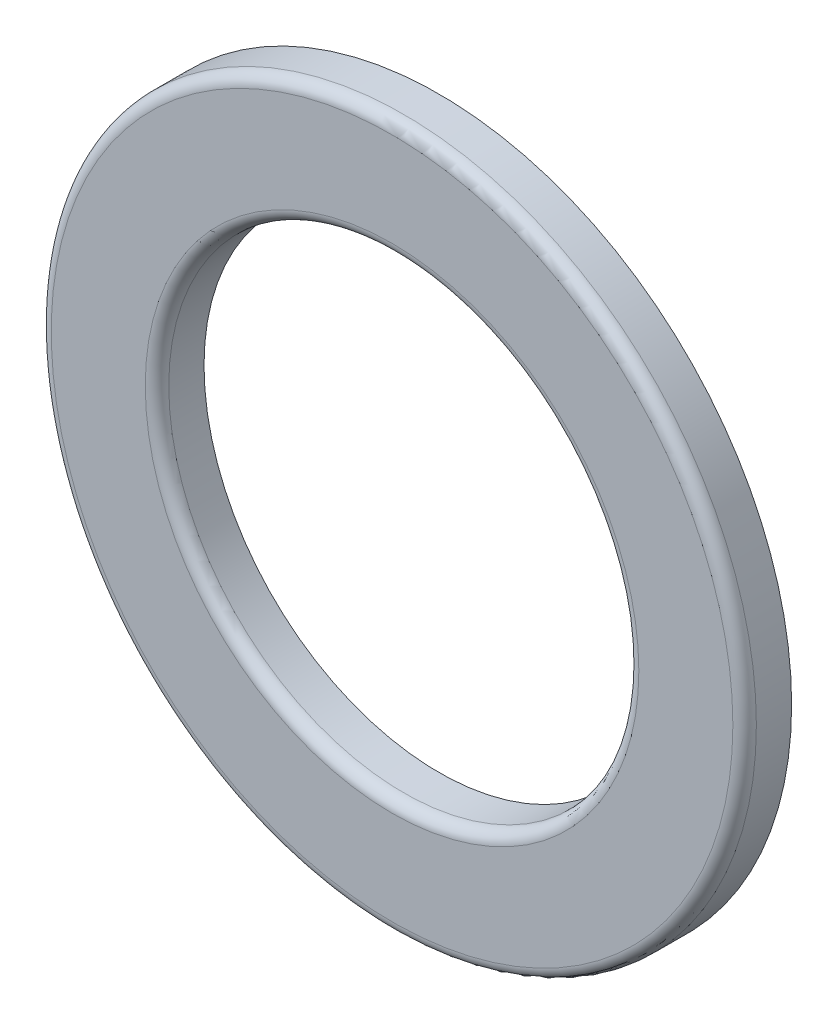
ISO-10303-21;
HEADER;
FILE_DESCRIPTION(('STEP AP214'),'2;1');
FILE_NAME('part.step','',(''),(''),'','','');
FILE_SCHEMA(('AUTOMOTIVE_DESIGN { 1 0 10303 214 1 1 1 1 }'));
ENDSEC;
DATA;
#1=APPLICATION_CONTEXT('core data for automotive mechanical design processes');
#2=APPLICATION_PROTOCOL_DEFINITION('international standard','automotive_design',2000,#1);
#3=PRODUCT_CONTEXT('',#1,'mechanical');
#4=PRODUCT('Part','Part','',(#3));
#5=PRODUCT_RELATED_PRODUCT_CATEGORY('part','',(#4));
#6=PRODUCT_DEFINITION_FORMATION('','',#4);
#7=PRODUCT_DEFINITION_CONTEXT('part definition',#1,'design');
#8=PRODUCT_DEFINITION('design','',#6,#7);
#9=PRODUCT_DEFINITION_SHAPE('','',#8);
#10=(LENGTH_UNIT() NAMED_UNIT(*) SI_UNIT(.MILLI.,.METRE.));
#11=(NAMED_UNIT(*) PLANE_ANGLE_UNIT() SI_UNIT($,.RADIAN.));
#12=(NAMED_UNIT(*) SI_UNIT($,.STERADIAN.) SOLID_ANGLE_UNIT());
#13=UNCERTAINTY_MEASURE_WITH_UNIT(LENGTH_MEASURE(1.E-05),#10,'distance_accuracy_value','');
#14=(GEOMETRIC_REPRESENTATION_CONTEXT(3) GLOBAL_UNCERTAINTY_ASSIGNED_CONTEXT((#13)) GLOBAL_UNIT_ASSIGNED_CONTEXT((#10,
#11,#12)) REPRESENTATION_CONTEXT('',''));
#15=CARTESIAN_POINT('',(0.,0.,0.));
#16=DIRECTION('',(0.,0.,1.));
#17=DIRECTION('',(1.,0.,0.));
#18=AXIS2_PLACEMENT_3D('',#15,#16,#17);
#19=CARTESIAN_POINT('',(0.,0.,2.));
#20=DIRECTION('',(0.,0.,1.));
#21=DIRECTION('',(1.,0.,0.));
#22=AXIS2_PLACEMENT_3D('',#19,#20,#21);
#23=PLANE('',#22);
#24=CARTESIAN_POINT('',(0.,0.,2.));
#25=DIRECTION('',(0.,0.,1.));
#26=DIRECTION('',(1.,0.,0.));
#27=AXIS2_PLACEMENT_3D('',#24,#25,#26);
#28=CIRCLE('',#27,10.5);
#29=CARTESIAN_POINT('',(10.5,0.,2.));
#30=VERTEX_POINT('',#29);
#31=EDGE_CURVE('E37',#30,#30,#28,.F.);
#32=ORIENTED_EDGE('',*,*,#31,.T.);
#33=EDGE_LOOP('',(#32));
#34=FACE_BOUND('',#33,.T.);
#35=CARTESIAN_POINT('',(0.,0.,2.));
#36=DIRECTION('',(0.,0.,1.));
#37=DIRECTION('',(1.,0.,0.));
#38=AXIS2_PLACEMENT_3D('',#35,#36,#37);
#39=CIRCLE('',#38,14.5);
#40=CARTESIAN_POINT('',(14.5,0.,2.));
#41=VERTEX_POINT('',#40);
#42=EDGE_CURVE('E41',#41,#41,#39,.T.);
#43=ORIENTED_EDGE('',*,*,#42,.T.);
#44=EDGE_LOOP('',(#43));
#45=FACE_BOUND('',#44,.T.);
#46=ADVANCED_FACE('F30',(#34,#45),#23,.T.);
#47=CARTESIAN_POINT('',(0.,0.,0.));
#48=DIRECTION('',(0.,0.,1.));
#49=DIRECTION('',(1.,0.,0.));
#50=AXIS2_PLACEMENT_3D('',#47,#48,#49);
#51=PLANE('',#50);
#52=CARTESIAN_POINT('',(0.,0.,0.));
#53=DIRECTION('',(0.,0.,1.));
#54=DIRECTION('',(1.,0.,0.));
#55=AXIS2_PLACEMENT_3D('',#52,#53,#54);
#56=CIRCLE('',#55,15.);
#57=CARTESIAN_POINT('',(15.,0.,0.));
#58=VERTEX_POINT('',#57);
#59=EDGE_CURVE('E50',#58,#58,#56,.T.);
#60=ORIENTED_EDGE('',*,*,#59,.F.);
#61=EDGE_LOOP('',(#60));
#62=FACE_BOUND('',#61,.T.);
#63=CARTESIAN_POINT('',(0.,0.,0.));
#64=DIRECTION('',(0.,0.,1.));
#65=DIRECTION('',(1.,0.,0.));
#66=AXIS2_PLACEMENT_3D('',#63,#64,#65);
#67=CIRCLE('',#66,10.);
#68=CARTESIAN_POINT('',(10.,0.,0.));
#69=VERTEX_POINT('',#68);
#70=EDGE_CURVE('E53',#69,#69,#67,.T.);
#71=ORIENTED_EDGE('',*,*,#70,.T.);
#72=EDGE_LOOP('',(#71));
#73=FACE_BOUND('',#72,.T.);
#74=ADVANCED_FACE('F57',(#62,#73),#51,.F.);
#75=CARTESIAN_POINT('',(0.,0.,2.));
#76=DIRECTION('',(0.,0.,-1.));
#77=DIRECTION('',(-1.,0.,0.));
#78=AXIS2_PLACEMENT_3D('',#75,#76,#77);
#79=CYLINDRICAL_SURFACE('',#78,15.);
#80=CARTESIAN_POINT('',(0.,0.,1.5));
#81=DIRECTION('',(0.,0.,1.));
#82=DIRECTION('',(1.,0.,0.));
#83=AXIS2_PLACEMENT_3D('',#80,#81,#82);
#84=CIRCLE('',#83,15.);
#85=CARTESIAN_POINT('',(15.,0.,1.5));
#86=VERTEX_POINT('',#85);
#87=EDGE_CURVE('E10',#86,#86,#84,.F.);
#88=ORIENTED_EDGE('',*,*,#87,.T.);
#89=EDGE_LOOP('',(#88));
#90=FACE_BOUND('',#89,.T.);
#91=ORIENTED_EDGE('',*,*,#59,.T.);
#92=EDGE_LOOP('',(#91));
#93=FACE_BOUND('',#92,.T.);
#94=ADVANCED_FACE('F62',(#90,#93),#79,.T.);
#95=CARTESIAN_POINT('',(0.,0.,2.));
#96=DIRECTION('',(0.,0.,-1.));
#97=DIRECTION('',(-1.,0.,0.));
#98=AXIS2_PLACEMENT_3D('',#95,#96,#97);
#99=CYLINDRICAL_SURFACE('',#98,10.);
#100=CARTESIAN_POINT('',(0.,0.,1.5));
#101=DIRECTION('',(0.,0.,1.));
#102=DIRECTION('',(1.,0.,0.));
#103=AXIS2_PLACEMENT_3D('',#100,#101,#102);
#104=CIRCLE('',#103,10.);
#105=CARTESIAN_POINT('',(10.,0.,1.5));
#106=VERTEX_POINT('',#105);
#107=EDGE_CURVE('E45',#106,#106,#104,.T.);
#108=ORIENTED_EDGE('',*,*,#107,.T.);
#109=EDGE_LOOP('',(#108));
#110=FACE_BOUND('',#109,.T.);
#111=ORIENTED_EDGE('',*,*,#70,.F.);
#112=EDGE_LOOP('',(#111));
#113=FACE_BOUND('',#112,.T.);
#114=ADVANCED_FACE('F59',(#110,#113),#99,.F.);
#115=CARTESIAN_POINT('',(0.,0.,1.5));
#116=DIRECTION('',(0.,0.,1.));
#117=DIRECTION('',(1.,0.,0.));
#118=AXIS2_PLACEMENT_3D('',#115,#116,#117);
#119=TOROIDAL_SURFACE('',#118,10.5,0.5);
#120=ORIENTED_EDGE('',*,*,#31,.F.);
#121=EDGE_LOOP('',(#120));
#122=FACE_BOUND('',#121,.T.);
#123=ORIENTED_EDGE('',*,*,#107,.F.);
#124=EDGE_LOOP('',(#123));
#125=FACE_BOUND('',#124,.T.);
#126=ADVANCED_FACE('F61',(#122,#125),#119,.T.);
#127=CARTESIAN_POINT('',(0.,0.,1.5));
#128=DIRECTION('',(0.,0.,1.));
#129=DIRECTION('',(1.,0.,0.));
#130=AXIS2_PLACEMENT_3D('',#127,#128,#129);
#131=TOROIDAL_SURFACE('',#130,14.5,0.5);
#132=ORIENTED_EDGE('',*,*,#87,.F.);
#133=EDGE_LOOP('',(#132));
#134=FACE_BOUND('',#133,.T.);
#135=ORIENTED_EDGE('',*,*,#42,.F.);
#136=EDGE_LOOP('',(#135));
#137=FACE_BOUND('',#136,.T.);
#138=ADVANCED_FACE('F32',(#134,#137),#131,.T.);
#139=CLOSED_SHELL('',(#46,#74,#94,#114,#126,#138));
#140=MANIFOLD_SOLID_BREP('B2',#139);
#141=ADVANCED_BREP_SHAPE_REPRESENTATION('',(#18,#140),#14);
#142=SHAPE_DEFINITION_REPRESENTATION(#9,#141);
ENDSEC;
END-ISO-10303-21;
